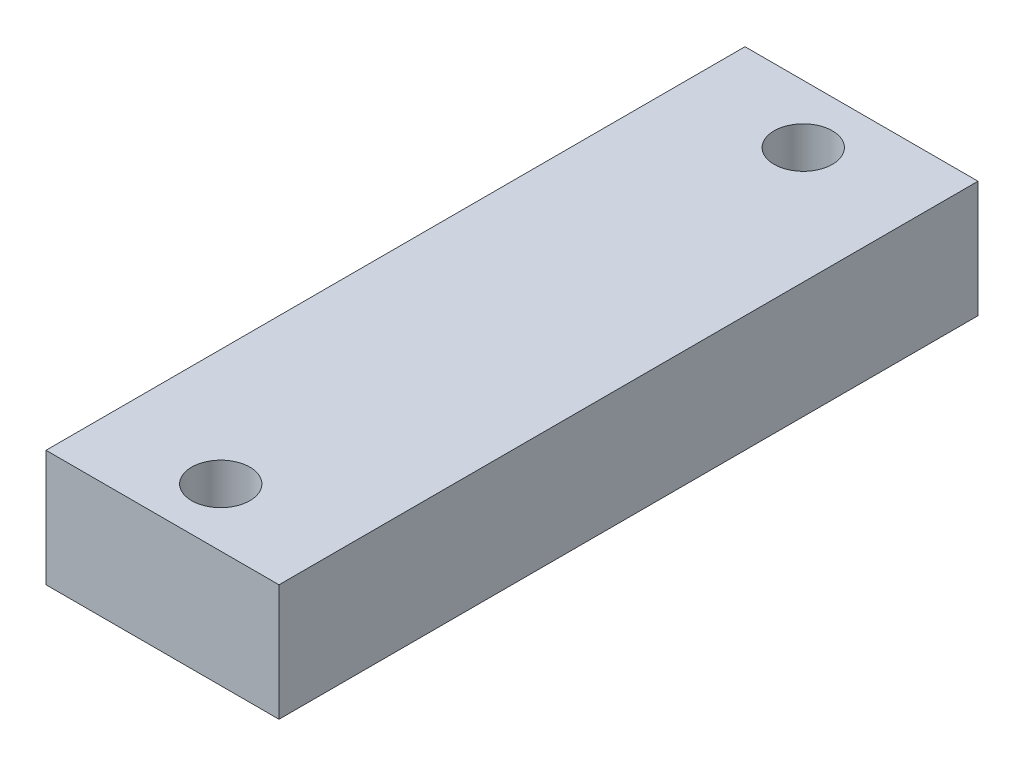
ISO-10303-21;
HEADER;
FILE_DESCRIPTION(('STEP AP214'),'2;1');
FILE_NAME('part.step','',(''),(''),'','','');
FILE_SCHEMA(('AUTOMOTIVE_DESIGN { 1 0 10303 214 1 1 1 1 }'));
ENDSEC;
DATA;
#1=APPLICATION_CONTEXT('core data for automotive mechanical design processes');
#2=APPLICATION_PROTOCOL_DEFINITION('international standard','automotive_design',2000,#1);
#3=PRODUCT_CONTEXT('',#1,'mechanical');
#4=PRODUCT('Part','Part','',(#3));
#5=PRODUCT_RELATED_PRODUCT_CATEGORY('part','',(#4));
#6=PRODUCT_DEFINITION_FORMATION('','',#4);
#7=PRODUCT_DEFINITION_CONTEXT('part definition',#1,'design');
#8=PRODUCT_DEFINITION('design','',#6,#7);
#9=PRODUCT_DEFINITION_SHAPE('','',#8);
#10=(LENGTH_UNIT() NAMED_UNIT(*) SI_UNIT(.MILLI.,.METRE.));
#11=(NAMED_UNIT(*) PLANE_ANGLE_UNIT() SI_UNIT($,.RADIAN.));
#12=(NAMED_UNIT(*) SI_UNIT($,.STERADIAN.) SOLID_ANGLE_UNIT());
#13=UNCERTAINTY_MEASURE_WITH_UNIT(LENGTH_MEASURE(1.E-05),#10,'distance_accuracy_value','');
#14=(GEOMETRIC_REPRESENTATION_CONTEXT(3) GLOBAL_UNCERTAINTY_ASSIGNED_CONTEXT((#13)) GLOBAL_UNIT_ASSIGNED_CONTEXT((#10,
#11,#12)) REPRESENTATION_CONTEXT('',''));
#15=CARTESIAN_POINT('',(0.,0.,0.));
#16=DIRECTION('',(0.,0.,1.));
#17=DIRECTION('',(1.,0.,0.));
#18=AXIS2_PLACEMENT_3D('',#15,#16,#17);
#19=CARTESIAN_POINT('',(0.,6.35,0.));
#20=DIRECTION('',(0.,-1.,0.));
#21=DIRECTION('',(0.,0.,-1.));
#22=AXIS2_PLACEMENT_3D('',#19,#20,#21);
#23=PLANE('',#22);
#24=DIRECTION('',(0.,0.,1.));
#25=VECTOR('',#24,1.);
#26=CARTESIAN_POINT('',(0.,6.35,0.));
#27=LINE('',#26,#25);
#28=CARTESIAN_POINT('',(0.,6.35,-38.1));
#29=VERTEX_POINT('',#28);
#30=CARTESIAN_POINT('',(0.,6.35,0.));
#31=VERTEX_POINT('',#30);
#32=EDGE_CURVE('E84',#29,#31,#27,.T.);
#33=ORIENTED_EDGE('',*,*,#32,.T.);
#34=DIRECTION('',(1.,0.,0.));
#35=VECTOR('',#34,1.);
#36=CARTESIAN_POINT('',(0.,6.35,0.));
#37=LINE('',#36,#35);
#38=CARTESIAN_POINT('',(12.7,6.35,0.));
#39=VERTEX_POINT('',#38);
#40=EDGE_CURVE('E79',#31,#39,#37,.T.);
#41=ORIENTED_EDGE('',*,*,#40,.T.);
#42=DIRECTION('',(0.,0.,-1.));
#43=VECTOR('',#42,1.);
#44=CARTESIAN_POINT('',(12.7,6.35,0.));
#45=LINE('',#44,#43);
#46=CARTESIAN_POINT('',(12.7,6.35,-38.1));
#47=VERTEX_POINT('',#46);
#48=EDGE_CURVE('E82',#39,#47,#45,.T.);
#49=ORIENTED_EDGE('',*,*,#48,.T.);
#50=DIRECTION('',(-1.,0.,0.));
#51=VECTOR('',#50,1.);
#52=CARTESIAN_POINT('',(0.,6.35,-38.1));
#53=LINE('',#52,#51);
#54=EDGE_CURVE('E49',#47,#29,#53,.T.);
#55=ORIENTED_EDGE('',*,*,#54,.T.);
#56=EDGE_LOOP('',(#33,#41,#49,#55));
#57=FACE_BOUND('',#56,.T.);
#58=CARTESIAN_POINT('',(6.35,6.35,-34.925));
#59=DIRECTION('',(0.,1.,0.));
#60=DIRECTION('',(0.,0.,1.));
#61=AXIS2_PLACEMENT_3D('',#58,#59,#60);
#62=CIRCLE('',#61,1.5875);
#63=CARTESIAN_POINT('',(6.35,6.35,-33.3375));
#64=VERTEX_POINT('',#63);
#65=EDGE_CURVE('E99',#64,#64,#62,.T.);
#66=ORIENTED_EDGE('',*,*,#65,.F.);
#67=EDGE_LOOP('',(#66));
#68=FACE_BOUND('',#67,.T.);
#69=CARTESIAN_POINT('',(6.35,6.35,-3.175));
#70=DIRECTION('',(0.,1.,0.));
#71=DIRECTION('',(0.,0.,1.));
#72=AXIS2_PLACEMENT_3D('',#69,#70,#71);
#73=CIRCLE('',#72,1.5875);
#74=CARTESIAN_POINT('',(6.35,6.35,-1.5875));
#75=VERTEX_POINT('',#74);
#76=EDGE_CURVE('E114',#75,#75,#73,.T.);
#77=ORIENTED_EDGE('',*,*,#76,.F.);
#78=EDGE_LOOP('',(#77));
#79=FACE_BOUND('',#78,.T.);
#80=ADVANCED_FACE('F32',(#57,#68,#79),#23,.F.);
#81=CARTESIAN_POINT('',(0.,0.,0.));
#82=DIRECTION('',(0.,-1.,0.));
#83=DIRECTION('',(0.,0.,-1.));
#84=AXIS2_PLACEMENT_3D('',#81,#82,#83);
#85=PLANE('',#84);
#86=CARTESIAN_POINT('',(6.35,0.,-34.925));
#87=DIRECTION('',(0.,1.,0.));
#88=DIRECTION('',(0.,0.,1.));
#89=AXIS2_PLACEMENT_3D('',#86,#87,#88);
#90=CIRCLE('',#89,1.5875);
#91=CARTESIAN_POINT('',(6.35,0.,-33.3375));
#92=VERTEX_POINT('',#91);
#93=EDGE_CURVE('E111',#92,#92,#90,.T.);
#94=ORIENTED_EDGE('',*,*,#93,.T.);
#95=EDGE_LOOP('',(#94));
#96=FACE_BOUND('',#95,.T.);
#97=DIRECTION('',(0.,0.,1.));
#98=VECTOR('',#97,1.);
#99=CARTESIAN_POINT('',(0.,0.,0.));
#100=LINE('',#99,#98);
#101=CARTESIAN_POINT('',(0.,0.,-38.1));
#102=VERTEX_POINT('',#101);
#103=CARTESIAN_POINT('',(0.,0.,0.));
#104=VERTEX_POINT('',#103);
#105=EDGE_CURVE('E96',#102,#104,#100,.T.);
#106=ORIENTED_EDGE('',*,*,#105,.F.);
#107=DIRECTION('',(-1.,0.,0.));
#108=VECTOR('',#107,1.);
#109=CARTESIAN_POINT('',(0.,0.,-38.1));
#110=LINE('',#109,#108);
#111=CARTESIAN_POINT('',(12.7,0.,-38.1));
#112=VERTEX_POINT('',#111);
#113=EDGE_CURVE('E72',#112,#102,#110,.T.);
#114=ORIENTED_EDGE('',*,*,#113,.F.);
#115=DIRECTION('',(0.,0.,-1.));
#116=VECTOR('',#115,1.);
#117=CARTESIAN_POINT('',(12.7,0.,0.));
#118=LINE('',#117,#116);
#119=CARTESIAN_POINT('',(12.7,0.,0.));
#120=VERTEX_POINT('',#119);
#121=EDGE_CURVE('E66',#120,#112,#118,.T.);
#122=ORIENTED_EDGE('',*,*,#121,.F.);
#123=DIRECTION('',(1.,0.,0.));
#124=VECTOR('',#123,1.);
#125=CARTESIAN_POINT('',(0.,0.,0.));
#126=LINE('',#125,#124);
#127=EDGE_CURVE('E88',#104,#120,#126,.T.);
#128=ORIENTED_EDGE('',*,*,#127,.F.);
#129=EDGE_LOOP('',(#106,#114,#122,#128));
#130=FACE_BOUND('',#129,.T.);
#131=CARTESIAN_POINT('',(6.35,0.,-3.175));
#132=DIRECTION('',(0.,1.,0.));
#133=DIRECTION('',(0.,0.,1.));
#134=AXIS2_PLACEMENT_3D('',#131,#132,#133);
#135=CIRCLE('',#134,1.5875);
#136=CARTESIAN_POINT('',(6.35,0.,-1.5875));
#137=VERTEX_POINT('',#136);
#138=EDGE_CURVE('E117',#137,#137,#135,.T.);
#139=ORIENTED_EDGE('',*,*,#138,.T.);
#140=EDGE_LOOP('',(#139));
#141=FACE_BOUND('',#140,.T.);
#142=ADVANCED_FACE('F107',(#96,#130,#141),#85,.T.);
#143=CARTESIAN_POINT('',(0.,6.35,0.));
#144=DIRECTION('',(1.,0.,0.));
#145=DIRECTION('',(0.,0.,-1.));
#146=AXIS2_PLACEMENT_3D('',#143,#144,#145);
#147=PLANE('',#146);
#148=ORIENTED_EDGE('',*,*,#105,.T.);
#149=DIRECTION('',(0.,-1.,0.));
#150=VECTOR('',#149,1.);
#151=CARTESIAN_POINT('',(0.,6.35,0.));
#152=LINE('',#151,#150);
#153=EDGE_CURVE('E11',#31,#104,#152,.T.);
#154=ORIENTED_EDGE('',*,*,#153,.F.);
#155=ORIENTED_EDGE('',*,*,#32,.F.);
#156=DIRECTION('',(0.,-1.,0.));
#157=VECTOR('',#156,1.);
#158=CARTESIAN_POINT('',(0.,6.35,-38.1));
#159=LINE('',#158,#157);
#160=EDGE_CURVE('E92',#29,#102,#159,.T.);
#161=ORIENTED_EDGE('',*,*,#160,.T.);
#162=EDGE_LOOP('',(#148,#154,#155,#161));
#163=FACE_BOUND('',#162,.T.);
#164=ADVANCED_FACE('F34',(#163),#147,.F.);
#165=CARTESIAN_POINT('',(0.,6.35,0.));
#166=DIRECTION('',(0.,0.,-1.));
#167=DIRECTION('',(-1.,0.,0.));
#168=AXIS2_PLACEMENT_3D('',#165,#166,#167);
#169=PLANE('',#168);
#170=ORIENTED_EDGE('',*,*,#127,.T.);
#171=DIRECTION('',(0.,-1.,0.));
#172=VECTOR('',#171,1.);
#173=CARTESIAN_POINT('',(12.7,6.35,0.));
#174=LINE('',#173,#172);
#175=EDGE_CURVE('E41',#39,#120,#174,.T.);
#176=ORIENTED_EDGE('',*,*,#175,.F.);
#177=ORIENTED_EDGE('',*,*,#40,.F.);
#178=ORIENTED_EDGE('',*,*,#153,.T.);
#179=EDGE_LOOP('',(#170,#176,#177,#178));
#180=FACE_BOUND('',#179,.T.);
#181=ADVANCED_FACE('F87',(#180),#169,.F.);
#182=CARTESIAN_POINT('',(12.7,6.35,0.));
#183=DIRECTION('',(-1.,0.,0.));
#184=DIRECTION('',(0.,0.,1.));
#185=AXIS2_PLACEMENT_3D('',#182,#183,#184);
#186=PLANE('',#185);
#187=ORIENTED_EDGE('',*,*,#121,.T.);
#188=DIRECTION('',(0.,-1.,0.));
#189=VECTOR('',#188,1.);
#190=CARTESIAN_POINT('',(12.7,6.35,-38.1));
#191=LINE('',#190,#189);
#192=EDGE_CURVE('E89',#47,#112,#191,.T.);
#193=ORIENTED_EDGE('',*,*,#192,.F.);
#194=ORIENTED_EDGE('',*,*,#48,.F.);
#195=ORIENTED_EDGE('',*,*,#175,.T.);
#196=EDGE_LOOP('',(#187,#193,#194,#195));
#197=FACE_BOUND('',#196,.T.);
#198=ADVANCED_FACE('F90',(#197),#186,.F.);
#199=CARTESIAN_POINT('',(0.,6.35,-38.1));
#200=DIRECTION('',(0.,0.,1.));
#201=DIRECTION('',(1.,0.,0.));
#202=AXIS2_PLACEMENT_3D('',#199,#200,#201);
#203=PLANE('',#202);
#204=ORIENTED_EDGE('',*,*,#113,.T.);
#205=ORIENTED_EDGE('',*,*,#160,.F.);
#206=ORIENTED_EDGE('',*,*,#54,.F.);
#207=ORIENTED_EDGE('',*,*,#192,.T.);
#208=EDGE_LOOP('',(#204,#205,#206,#207));
#209=FACE_BOUND('',#208,.T.);
#210=ADVANCED_FACE('F104',(#209),#203,.F.);
#211=CARTESIAN_POINT('',(6.35,6.35,-34.925));
#212=DIRECTION('',(0.,-1.,0.));
#213=DIRECTION('',(0.,0.,-1.));
#214=AXIS2_PLACEMENT_3D('',#211,#212,#213);
#215=CYLINDRICAL_SURFACE('',#214,1.5875);
#216=ORIENTED_EDGE('',*,*,#65,.T.);
#217=EDGE_LOOP('',(#216));
#218=FACE_BOUND('',#217,.T.);
#219=ORIENTED_EDGE('',*,*,#93,.F.);
#220=EDGE_LOOP('',(#219));
#221=FACE_BOUND('',#220,.T.);
#222=ADVANCED_FACE('F134',(#218,#221),#215,.F.);
#223=CARTESIAN_POINT('',(6.35,6.35,-3.175));
#224=DIRECTION('',(0.,-1.,0.));
#225=DIRECTION('',(0.,0.,-1.));
#226=AXIS2_PLACEMENT_3D('',#223,#224,#225);
#227=CYLINDRICAL_SURFACE('',#226,1.5875);
#228=ORIENTED_EDGE('',*,*,#76,.T.);
#229=EDGE_LOOP('',(#228));
#230=FACE_BOUND('',#229,.T.);
#231=ORIENTED_EDGE('',*,*,#138,.F.);
#232=EDGE_LOOP('',(#231));
#233=FACE_BOUND('',#232,.T.);
#234=ADVANCED_FACE('F123',(#230,#233),#227,.F.);
#235=CLOSED_SHELL('',(#80,#142,#164,#181,#198,#210,#222,#234));
#236=MANIFOLD_SOLID_BREP('B2',#235);
#237=ADVANCED_BREP_SHAPE_REPRESENTATION('',(#18,#236),#14);
#238=SHAPE_DEFINITION_REPRESENTATION(#9,#237);
ENDSEC;
END-ISO-10303-21;
